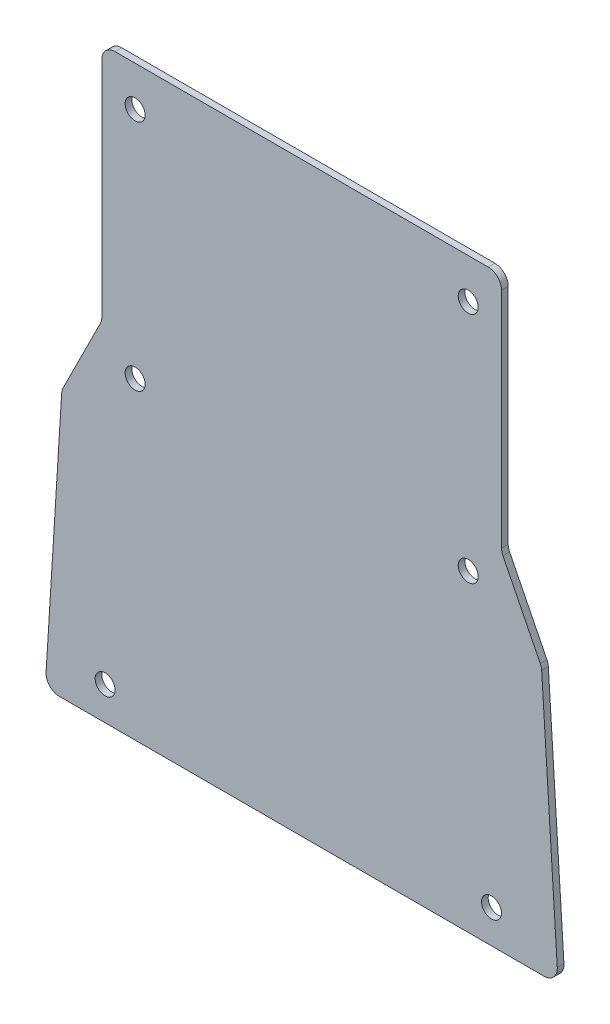
ISO-10303-21;
HEADER;
FILE_DESCRIPTION(('STEP AP214'),'2;1');
FILE_NAME('part.step','',(''),(''),'','','');
FILE_SCHEMA(('AUTOMOTIVE_DESIGN { 1 0 10303 214 1 1 1 1 }'));
ENDSEC;
DATA;
#1=APPLICATION_CONTEXT('core data for automotive mechanical design processes');
#2=APPLICATION_PROTOCOL_DEFINITION('international standard','automotive_design',2000,#1);
#3=PRODUCT_CONTEXT('',#1,'mechanical');
#4=PRODUCT('Part','Part','',(#3));
#5=PRODUCT_RELATED_PRODUCT_CATEGORY('part','',(#4));
#6=PRODUCT_DEFINITION_FORMATION('','',#4);
#7=PRODUCT_DEFINITION_CONTEXT('part definition',#1,'design');
#8=PRODUCT_DEFINITION('design','',#6,#7);
#9=PRODUCT_DEFINITION_SHAPE('','',#8);
#10=(LENGTH_UNIT() NAMED_UNIT(*) SI_UNIT(.MILLI.,.METRE.));
#11=(NAMED_UNIT(*) PLANE_ANGLE_UNIT() SI_UNIT($,.RADIAN.));
#12=(NAMED_UNIT(*) SI_UNIT($,.STERADIAN.) SOLID_ANGLE_UNIT());
#13=UNCERTAINTY_MEASURE_WITH_UNIT(LENGTH_MEASURE(1.E-05),#10,'distance_accuracy_value','');
#14=(GEOMETRIC_REPRESENTATION_CONTEXT(3) GLOBAL_UNCERTAINTY_ASSIGNED_CONTEXT((#13)) GLOBAL_UNIT_ASSIGNED_CONTEXT((#10,
#11,#12)) REPRESENTATION_CONTEXT('',''));
#15=CARTESIAN_POINT('',(0.,0.,0.));
#16=DIRECTION('',(0.,0.,1.));
#17=DIRECTION('',(1.,0.,0.));
#18=AXIS2_PLACEMENT_3D('',#15,#16,#17);
#19=CARTESIAN_POINT('',(38.5,0.,-1.));
#20=DIRECTION('',(0.998052578482888,0.0623782861551806,0.));
#21=DIRECTION('',(-0.0623782861551806,0.998052578482889,0.));
#22=AXIS2_PLACEMENT_3D('',#19,#20,#21);
#23=PLANE('',#22);
#24=DIRECTION('',(-0.0623782861551806,0.998052578482889,0.));
#25=VECTOR('',#24,1.);
#26=CARTESIAN_POINT('',(38.5,0.,-1.));
#27=LINE('',#26,#25);
#28=CARTESIAN_POINT('',(38.3672027142306,2.12475657231036,-1.));
#29=VERTEX_POINT('',#28);
#30=CARTESIAN_POINT('',(36.025369219197,39.5940924928484,-1.));
#31=VERTEX_POINT('',#30);
#32=EDGE_CURVE('E292',#29,#31,#27,.T.);
#33=ORIENTED_EDGE('',*,*,#32,.T.);
#34=DIRECTION('',(0.,0.,1.));
#35=VECTOR('',#34,1.);
#36=CARTESIAN_POINT('',(36.025369219197,39.5940924928484,-1.));
#37=LINE('',#36,#35);
#38=CARTESIAN_POINT('',(36.025369219197,39.5940924928484,0.));
#39=VERTEX_POINT('',#38);
#40=EDGE_CURVE('E167',#31,#39,#37,.T.);
#41=ORIENTED_EDGE('',*,*,#40,.T.);
#42=DIRECTION('',(-0.0623782861551806,0.998052578482889,0.));
#43=VECTOR('',#42,1.);
#44=CARTESIAN_POINT('',(38.5,0.,0.));
#45=LINE('',#44,#43);
#46=CARTESIAN_POINT('',(38.3672027142306,2.12475657231036,0.));
#47=VERTEX_POINT('',#46);
#48=EDGE_CURVE('E159',#47,#39,#45,.T.);
#49=ORIENTED_EDGE('',*,*,#48,.F.);
#50=DIRECTION('',(0.,0.,1.));
#51=VECTOR('',#50,1.);
#52=CARTESIAN_POINT('',(38.3672027142306,2.12475657231036,-1.));
#53=LINE('',#52,#51);
#54=EDGE_CURVE('E172',#47,#29,#53,.F.);
#55=ORIENTED_EDGE('',*,*,#54,.T.);
#56=EDGE_LOOP('',(#33,#41,#49,#55));
#57=FACE_BOUND('',#56,.T.);
#58=ADVANCED_FACE('F42',(#57),#23,.T.);
#59=CARTESIAN_POINT('',(-38.5,0.,-1.));
#60=DIRECTION('',(0.,-1.,0.));
#61=DIRECTION('',(0.,0.,-1.));
#62=AXIS2_PLACEMENT_3D('',#59,#60,#61);
#63=PLANE('',#62);
#64=DIRECTION('',(1.,0.,0.));
#65=VECTOR('',#64,1.);
#66=CARTESIAN_POINT('',(-38.5,0.,0.));
#67=LINE('',#66,#65);
#68=CARTESIAN_POINT('',(-36.3710975572648,0.,0.));
#69=VERTEX_POINT('',#68);
#70=CARTESIAN_POINT('',(36.3710975572648,0.,0.));
#71=VERTEX_POINT('',#70);
#72=EDGE_CURVE('E161',#69,#71,#67,.T.);
#73=ORIENTED_EDGE('',*,*,#72,.F.);
#74=DIRECTION('',(0.,0.,1.));
#75=VECTOR('',#74,1.);
#76=CARTESIAN_POINT('',(-36.3710975572648,0.,-1.));
#77=LINE('',#76,#75);
#78=CARTESIAN_POINT('',(-36.3710975572648,0.,-1.));
#79=VERTEX_POINT('',#78);
#80=EDGE_CURVE('E239',#69,#79,#77,.F.);
#81=ORIENTED_EDGE('',*,*,#80,.T.);
#82=DIRECTION('',(1.,0.,0.));
#83=VECTOR('',#82,1.);
#84=CARTESIAN_POINT('',(-38.5,0.,-1.));
#85=LINE('',#84,#83);
#86=CARTESIAN_POINT('',(36.3710975572648,0.,-1.));
#87=VERTEX_POINT('',#86);
#88=EDGE_CURVE('E180',#79,#87,#85,.T.);
#89=ORIENTED_EDGE('',*,*,#88,.T.);
#90=DIRECTION('',(0.,0.,1.));
#91=VECTOR('',#90,1.);
#92=CARTESIAN_POINT('',(36.3710975572648,0.,-1.));
#93=LINE('',#92,#91);
#94=EDGE_CURVE('E237',#87,#71,#93,.T.);
#95=ORIENTED_EDGE('',*,*,#94,.T.);
#96=EDGE_LOOP('',(#73,#81,#89,#95));
#97=FACE_BOUND('',#96,.T.);
#98=ADVANCED_FACE('F323',(#97),#63,.T.);
#99=CARTESIAN_POINT('',(-38.5,0.,-1.));
#100=DIRECTION('',(-0.998052578482888,0.0623782861551806,0.));
#101=DIRECTION('',(-0.0623782861551806,-0.998052578482889,0.));
#102=AXIS2_PLACEMENT_3D('',#99,#100,#101);
#103=PLANE('',#102);
#104=DIRECTION('',(-0.0623782861551806,-0.998052578482889,0.));
#105=VECTOR('',#104,1.);
#106=CARTESIAN_POINT('',(-38.5,0.,0.));
#107=LINE('',#106,#105);
#108=CARTESIAN_POINT('',(-36.025369219197,39.5940924928484,0.));
#109=VERTEX_POINT('',#108);
#110=CARTESIAN_POINT('',(-38.3672027142306,2.12475657231036,0.));
#111=VERTEX_POINT('',#110);
#112=EDGE_CURVE('E258',#109,#111,#107,.T.);
#113=ORIENTED_EDGE('',*,*,#112,.F.);
#114=DIRECTION('',(0.,0.,1.));
#115=VECTOR('',#114,1.);
#116=CARTESIAN_POINT('',(-36.025369219197,39.5940924928484,-1.));
#117=LINE('',#116,#115);
#118=CARTESIAN_POINT('',(-36.025369219197,39.5940924928484,-1.));
#119=VERTEX_POINT('',#118);
#120=EDGE_CURVE('E235',#109,#119,#117,.F.);
#121=ORIENTED_EDGE('',*,*,#120,.T.);
#122=DIRECTION('',(-0.0623782861551806,-0.998052578482889,0.));
#123=VECTOR('',#122,1.);
#124=CARTESIAN_POINT('',(-38.5,0.,-1.));
#125=LINE('',#124,#123);
#126=CARTESIAN_POINT('',(-38.3672027142306,2.12475657231036,-1.));
#127=VERTEX_POINT('',#126);
#128=EDGE_CURVE('E184',#119,#127,#125,.T.);
#129=ORIENTED_EDGE('',*,*,#128,.T.);
#130=DIRECTION('',(0.,0.,1.));
#131=VECTOR('',#130,1.);
#132=CARTESIAN_POINT('',(-38.3672027142306,2.12475657231036,-1.));
#133=LINE('',#132,#131);
#134=EDGE_CURVE('E232',#127,#111,#133,.T.);
#135=ORIENTED_EDGE('',*,*,#134,.T.);
#136=EDGE_LOOP('',(#113,#121,#129,#135));
#137=FACE_BOUND('',#136,.T.);
#138=ADVANCED_FACE('F328',(#137),#103,.T.);
#139=CARTESIAN_POINT('',(-36.,40.,-1.));
#140=DIRECTION('',(-0.894427190999916,0.447213595499958,0.));
#141=DIRECTION('',(-0.447213595499958,-0.894427190999916,0.));
#142=AXIS2_PLACEMENT_3D('',#139,#140,#141);
#143=PLANE('',#142);
#144=DIRECTION('',(-0.447213595499958,-0.894427190999916,0.));
#145=VECTOR('',#144,1.);
#146=CARTESIAN_POINT('',(-36.,40.,0.));
#147=LINE('',#146,#145);
#148=CARTESIAN_POINT('',(-30.2111456180002,51.5777087639997,0.));
#149=VERTEX_POINT('',#148);
#150=CARTESIAN_POINT('',(-35.818118444231,40.3637631115379,0.));
#151=VERTEX_POINT('',#150);
#152=EDGE_CURVE('E247',#149,#151,#147,.T.);
#153=ORIENTED_EDGE('',*,*,#152,.F.);
#154=DIRECTION('',(0.,0.,1.));
#155=VECTOR('',#154,1.);
#156=CARTESIAN_POINT('',(-30.2111456180002,51.5777087639997,-1.));
#157=LINE('',#156,#155);
#158=CARTESIAN_POINT('',(-30.2111456180002,51.5777087639997,-1.));
#159=VERTEX_POINT('',#158);
#160=EDGE_CURVE('E230',#149,#159,#157,.F.);
#161=ORIENTED_EDGE('',*,*,#160,.T.);
#162=DIRECTION('',(-0.447213595499958,-0.894427190999916,0.));
#163=VECTOR('',#162,1.);
#164=CARTESIAN_POINT('',(-36.,40.,-1.));
#165=LINE('',#164,#163);
#166=CARTESIAN_POINT('',(-35.818118444231,40.3637631115379,-1.));
#167=VERTEX_POINT('',#166);
#168=EDGE_CURVE('E268',#159,#167,#165,.T.);
#169=ORIENTED_EDGE('',*,*,#168,.T.);
#170=DIRECTION('',(0.,0.,1.));
#171=VECTOR('',#170,1.);
#172=CARTESIAN_POINT('',(-35.818118444231,40.3637631115379,-1.));
#173=LINE('',#172,#171);
#174=EDGE_CURVE('E227',#167,#151,#173,.T.);
#175=ORIENTED_EDGE('',*,*,#174,.T.);
#176=EDGE_LOOP('',(#153,#161,#169,#175));
#177=FACE_BOUND('',#176,.T.);
#178=ADVANCED_FACE('F254',(#177),#143,.T.);
#179=CARTESIAN_POINT('',(-30.,52.,-1.));
#180=DIRECTION('',(-1.,0.,0.));
#181=DIRECTION('',(0.,0.,1.));
#182=AXIS2_PLACEMENT_3D('',#179,#180,#181);
#183=PLANE('',#182);
#184=DIRECTION('',(0.,-1.,0.));
#185=VECTOR('',#184,1.);
#186=CARTESIAN_POINT('',(-30.,52.,0.));
#187=LINE('',#186,#185);
#188=CARTESIAN_POINT('',(-30.,86.,0.));
#189=VERTEX_POINT('',#188);
#190=CARTESIAN_POINT('',(-30.,52.4721359549996,0.));
#191=VERTEX_POINT('',#190);
#192=EDGE_CURVE('E249',#189,#191,#187,.T.);
#193=ORIENTED_EDGE('',*,*,#192,.F.);
#194=DIRECTION('',(0.,0.,1.));
#195=VECTOR('',#194,1.);
#196=CARTESIAN_POINT('',(-30.,86.,-1.));
#197=LINE('',#196,#195);
#198=CARTESIAN_POINT('',(-30.,86.,-1.));
#199=VERTEX_POINT('',#198);
#200=EDGE_CURVE('E225',#189,#199,#197,.F.);
#201=ORIENTED_EDGE('',*,*,#200,.T.);
#202=DIRECTION('',(0.,-1.,0.));
#203=VECTOR('',#202,1.);
#204=CARTESIAN_POINT('',(-30.,52.,-1.));
#205=LINE('',#204,#203);
#206=CARTESIAN_POINT('',(-30.,52.4721359549996,-1.));
#207=VERTEX_POINT('',#206);
#208=EDGE_CURVE('E266',#199,#207,#205,.T.);
#209=ORIENTED_EDGE('',*,*,#208,.T.);
#210=DIRECTION('',(0.,0.,1.));
#211=VECTOR('',#210,1.);
#212=CARTESIAN_POINT('',(-30.,52.4721359549996,0.));
#213=LINE('',#212,#211);
#214=EDGE_CURVE('E222',#207,#191,#213,.T.);
#215=ORIENTED_EDGE('',*,*,#214,.T.);
#216=EDGE_LOOP('',(#193,#201,#209,#215));
#217=FACE_BOUND('',#216,.T.);
#218=ADVANCED_FACE('F270',(#217),#183,.T.);
#219=CARTESIAN_POINT('',(30.,88.,-1.));
#220=DIRECTION('',(0.,1.,0.));
#221=DIRECTION('',(0.,0.,1.));
#222=AXIS2_PLACEMENT_3D('',#219,#220,#221);
#223=PLANE('',#222);
#224=DIRECTION('',(-1.,0.,0.));
#225=VECTOR('',#224,1.);
#226=CARTESIAN_POINT('',(30.,88.,0.));
#227=LINE('',#226,#225);
#228=CARTESIAN_POINT('',(28.,88.,0.));
#229=VERTEX_POINT('',#228);
#230=CARTESIAN_POINT('',(-28.,88.,0.));
#231=VERTEX_POINT('',#230);
#232=EDGE_CURVE('E287',#229,#231,#227,.T.);
#233=ORIENTED_EDGE('',*,*,#232,.F.);
#234=DIRECTION('',(0.,0.,1.));
#235=VECTOR('',#234,1.);
#236=CARTESIAN_POINT('',(28.,88.,-1.));
#237=LINE('',#236,#235);
#238=CARTESIAN_POINT('',(28.,88.,-1.));
#239=VERTEX_POINT('',#238);
#240=EDGE_CURVE('E220',#229,#239,#237,.F.);
#241=ORIENTED_EDGE('',*,*,#240,.T.);
#242=DIRECTION('',(-1.,0.,0.));
#243=VECTOR('',#242,1.);
#244=CARTESIAN_POINT('',(30.,88.,-1.));
#245=LINE('',#244,#243);
#246=CARTESIAN_POINT('',(-28.,88.,-1.));
#247=VERTEX_POINT('',#246);
#248=EDGE_CURVE('E272',#239,#247,#245,.T.);
#249=ORIENTED_EDGE('',*,*,#248,.T.);
#250=DIRECTION('',(0.,0.,1.));
#251=VECTOR('',#250,1.);
#252=CARTESIAN_POINT('',(-28.,88.,-1.));
#253=LINE('',#252,#251);
#254=EDGE_CURVE('E217',#247,#231,#253,.T.);
#255=ORIENTED_EDGE('',*,*,#254,.T.);
#256=EDGE_LOOP('',(#233,#241,#249,#255));
#257=FACE_BOUND('',#256,.T.);
#258=ADVANCED_FACE('F308',(#257),#223,.T.);
#259=CARTESIAN_POINT('',(30.,52.,-1.));
#260=DIRECTION('',(1.,0.,0.));
#261=DIRECTION('',(0.,0.,-1.));
#262=AXIS2_PLACEMENT_3D('',#259,#260,#261);
#263=PLANE('',#262);
#264=DIRECTION('',(0.,1.,0.));
#265=VECTOR('',#264,1.);
#266=CARTESIAN_POINT('',(30.,52.,0.));
#267=LINE('',#266,#265);
#268=CARTESIAN_POINT('',(30.,52.4721359549996,0.));
#269=VERTEX_POINT('',#268);
#270=CARTESIAN_POINT('',(30.,86.,0.));
#271=VERTEX_POINT('',#270);
#272=EDGE_CURVE('E284',#269,#271,#267,.T.);
#273=ORIENTED_EDGE('',*,*,#272,.F.);
#274=DIRECTION('',(0.,0.,1.));
#275=VECTOR('',#274,1.);
#276=CARTESIAN_POINT('',(30.,52.4721359549996,-1.));
#277=LINE('',#276,#275);
#278=CARTESIAN_POINT('',(30.,52.4721359549996,-1.));
#279=VERTEX_POINT('',#278);
#280=EDGE_CURVE('E64',#269,#279,#277,.F.);
#281=ORIENTED_EDGE('',*,*,#280,.T.);
#282=DIRECTION('',(0.,1.,0.));
#283=VECTOR('',#282,1.);
#284=CARTESIAN_POINT('',(30.,52.,-1.));
#285=LINE('',#284,#283);
#286=CARTESIAN_POINT('',(30.,86.,-1.));
#287=VERTEX_POINT('',#286);
#288=EDGE_CURVE('E276',#279,#287,#285,.T.);
#289=ORIENTED_EDGE('',*,*,#288,.T.);
#290=DIRECTION('',(0.,0.,1.));
#291=VECTOR('',#290,1.);
#292=CARTESIAN_POINT('',(30.,86.,-1.));
#293=LINE('',#292,#291);
#294=EDGE_CURVE('E213',#287,#271,#293,.T.);
#295=ORIENTED_EDGE('',*,*,#294,.T.);
#296=EDGE_LOOP('',(#273,#281,#289,#295));
#297=FACE_BOUND('',#296,.T.);
#298=ADVANCED_FACE('F301',(#297),#263,.T.);
#299=CARTESIAN_POINT('',(36.,40.,-1.));
#300=DIRECTION('',(0.894427190999916,0.447213595499958,0.));
#301=DIRECTION('',(-0.447213595499958,0.894427190999916,0.));
#302=AXIS2_PLACEMENT_3D('',#299,#300,#301);
#303=PLANE('',#302);
#304=DIRECTION('',(-0.447213595499958,0.894427190999916,0.));
#305=VECTOR('',#304,1.);
#306=CARTESIAN_POINT('',(36.,40.,0.));
#307=LINE('',#306,#305);
#308=CARTESIAN_POINT('',(35.818118444231,40.3637631115379,0.));
#309=VERTEX_POINT('',#308);
#310=CARTESIAN_POINT('',(30.2111456180002,51.5777087639997,0.));
#311=VERTEX_POINT('',#310);
#312=EDGE_CURVE('E175',#309,#311,#307,.T.);
#313=ORIENTED_EDGE('',*,*,#312,.F.);
#314=DIRECTION('',(0.,0.,1.));
#315=VECTOR('',#314,1.);
#316=CARTESIAN_POINT('',(35.818118444231,40.3637631115379,-1.));
#317=LINE('',#316,#315);
#318=CARTESIAN_POINT('',(35.818118444231,40.3637631115379,-1.));
#319=VERTEX_POINT('',#318);
#320=EDGE_CURVE('E201',#309,#319,#317,.F.);
#321=ORIENTED_EDGE('',*,*,#320,.T.);
#322=DIRECTION('',(-0.447213595499958,0.894427190999916,0.));
#323=VECTOR('',#322,1.);
#324=CARTESIAN_POINT('',(36.,40.,-1.));
#325=LINE('',#324,#323);
#326=CARTESIAN_POINT('',(30.2111456180002,51.5777087639997,-1.));
#327=VERTEX_POINT('',#326);
#328=EDGE_CURVE('E293',#319,#327,#325,.T.);
#329=ORIENTED_EDGE('',*,*,#328,.T.);
#330=DIRECTION('',(0.,0.,1.));
#331=VECTOR('',#330,1.);
#332=CARTESIAN_POINT('',(30.2111456180002,51.5777087639997,0.));
#333=LINE('',#332,#331);
#334=EDGE_CURVE('E198',#327,#311,#333,.T.);
#335=ORIENTED_EDGE('',*,*,#334,.T.);
#336=EDGE_LOOP('',(#313,#321,#329,#335));
#337=FACE_BOUND('',#336,.T.);
#338=ADVANCED_FACE('F333',(#337),#303,.T.);
#339=CARTESIAN_POINT('',(0.,0.,-1.));
#340=DIRECTION('',(0.,0.,1.));
#341=DIRECTION('',(1.,0.,0.));
#342=AXIS2_PLACEMENT_3D('',#339,#340,#341);
#343=PLANE('',#342);
#344=CARTESIAN_POINT('',(28.5,5.,-1.));
#345=DIRECTION('',(0.,0.,1.));
#346=DIRECTION('',(1.,0.,0.));
#347=AXIS2_PLACEMENT_3D('',#344,#345,#346);
#348=CIRCLE('',#347,1.5);
#349=CARTESIAN_POINT('',(30.,5.,-1.));
#350=VERTEX_POINT('',#349);
#351=EDGE_CURVE('E626',#350,#350,#348,.T.);
#352=ORIENTED_EDGE('',*,*,#351,.T.);
#353=EDGE_LOOP('',(#352));
#354=FACE_BOUND('',#353,.T.);
#355=CARTESIAN_POINT('',(25.,82.,-1.));
#356=DIRECTION('',(0.,0.,1.));
#357=DIRECTION('',(1.,0.,0.));
#358=AXIS2_PLACEMENT_3D('',#355,#356,#357);
#359=CIRCLE('',#358,1.5);
#360=CARTESIAN_POINT('',(26.5,82.,-1.));
#361=VERTEX_POINT('',#360);
#362=EDGE_CURVE('E645',#361,#361,#359,.T.);
#363=ORIENTED_EDGE('',*,*,#362,.T.);
#364=EDGE_LOOP('',(#363));
#365=FACE_BOUND('',#364,.T.);
#366=CARTESIAN_POINT('',(-25.,47.,-1.));
#367=DIRECTION('',(0.,0.,1.));
#368=DIRECTION('',(1.,0.,0.));
#369=AXIS2_PLACEMENT_3D('',#366,#367,#368);
#370=CIRCLE('',#369,1.5);
#371=CARTESIAN_POINT('',(-23.5,47.,-1.));
#372=VERTEX_POINT('',#371);
#373=EDGE_CURVE('E637',#372,#372,#370,.T.);
#374=ORIENTED_EDGE('',*,*,#373,.T.);
#375=EDGE_LOOP('',(#374));
#376=FACE_BOUND('',#375,.T.);
#377=CARTESIAN_POINT('',(25.,47.,-1.));
#378=DIRECTION('',(0.,0.,1.));
#379=DIRECTION('',(1.,0.,0.));
#380=AXIS2_PLACEMENT_3D('',#377,#378,#379);
#381=CIRCLE('',#380,1.5);
#382=CARTESIAN_POINT('',(26.5,47.,-1.));
#383=VERTEX_POINT('',#382);
#384=EDGE_CURVE('E661',#383,#383,#381,.T.);
#385=ORIENTED_EDGE('',*,*,#384,.T.);
#386=EDGE_LOOP('',(#385));
#387=FACE_BOUND('',#386,.T.);
#388=CARTESIAN_POINT('',(-29.5,5.,-1.));
#389=DIRECTION('',(0.,0.,1.));
#390=DIRECTION('',(1.,0.,0.));
#391=AXIS2_PLACEMENT_3D('',#388,#389,#390);
#392=CIRCLE('',#391,1.5);
#393=CARTESIAN_POINT('',(-28.,5.,-1.));
#394=VERTEX_POINT('',#393);
#395=EDGE_CURVE('E630',#394,#394,#392,.T.);
#396=ORIENTED_EDGE('',*,*,#395,.T.);
#397=EDGE_LOOP('',(#396));
#398=FACE_BOUND('',#397,.T.);
#399=CARTESIAN_POINT('',(-25.,82.,-1.));
#400=DIRECTION('',(0.,0.,1.));
#401=DIRECTION('',(1.,0.,0.));
#402=AXIS2_PLACEMENT_3D('',#399,#400,#401);
#403=CIRCLE('',#402,1.5);
#404=CARTESIAN_POINT('',(-23.5,82.,-1.));
#405=VERTEX_POINT('',#404);
#406=EDGE_CURVE('E176',#405,#405,#403,.T.);
#407=ORIENTED_EDGE('',*,*,#406,.T.);
#408=EDGE_LOOP('',(#407));
#409=FACE_BOUND('',#408,.T.);
#410=ORIENTED_EDGE('',*,*,#328,.F.);
#411=CARTESIAN_POINT('',(34.0292640622312,39.469335920538,-1.));
#412=DIRECTION('',(0.,0.,1.));
#413=DIRECTION('',(1.,0.,0.));
#414=AXIS2_PLACEMENT_3D('',#411,#412,#413);
#415=CIRCLE('',#414,2.);
#416=EDGE_CURVE('E211',#319,#31,#415,.F.);
#417=ORIENTED_EDGE('',*,*,#416,.T.);
#418=ORIENTED_EDGE('',*,*,#32,.F.);
#419=CARTESIAN_POINT('',(36.3710975572648,2.,-1.));
#420=DIRECTION('',(0.,0.,1.));
#421=DIRECTION('',(1.,0.,0.));
#422=AXIS2_PLACEMENT_3D('',#419,#420,#421);
#423=CIRCLE('',#422,2.);
#424=EDGE_CURVE('E179',#29,#87,#423,.F.);
#425=ORIENTED_EDGE('',*,*,#424,.T.);
#426=ORIENTED_EDGE('',*,*,#88,.F.);
#427=CARTESIAN_POINT('',(-36.3710975572648,2.,-1.));
#428=DIRECTION('',(0.,0.,1.));
#429=DIRECTION('',(1.,0.,0.));
#430=AXIS2_PLACEMENT_3D('',#427,#428,#429);
#431=CIRCLE('',#430,2.);
#432=EDGE_CURVE('E204',#79,#127,#431,.F.);
#433=ORIENTED_EDGE('',*,*,#432,.T.);
#434=ORIENTED_EDGE('',*,*,#128,.F.);
#435=CARTESIAN_POINT('',(-34.0292640622312,39.469335920538,-1.));
#436=DIRECTION('',(0.,0.,1.));
#437=DIRECTION('',(1.,0.,0.));
#438=AXIS2_PLACEMENT_3D('',#435,#436,#437);
#439=CIRCLE('',#438,2.);
#440=EDGE_CURVE('E206',#119,#167,#439,.F.);
#441=ORIENTED_EDGE('',*,*,#440,.T.);
#442=ORIENTED_EDGE('',*,*,#168,.F.);
#443=CARTESIAN_POINT('',(-32.,52.4721359549996,-1.));
#444=DIRECTION('',(0.,0.,1.));
#445=DIRECTION('',(1.,0.,0.));
#446=AXIS2_PLACEMENT_3D('',#443,#444,#445);
#447=CIRCLE('',#446,2.);
#448=EDGE_CURVE('E11',#159,#207,#447,.T.);
#449=ORIENTED_EDGE('',*,*,#448,.T.);
#450=ORIENTED_EDGE('',*,*,#208,.F.);
#451=CARTESIAN_POINT('',(-28.,86.,-1.));
#452=DIRECTION('',(0.,0.,1.));
#453=DIRECTION('',(1.,0.,0.));
#454=AXIS2_PLACEMENT_3D('',#451,#452,#453);
#455=CIRCLE('',#454,2.);
#456=EDGE_CURVE('E208',#199,#247,#455,.F.);
#457=ORIENTED_EDGE('',*,*,#456,.T.);
#458=ORIENTED_EDGE('',*,*,#248,.F.);
#459=CARTESIAN_POINT('',(28.,86.,-1.));
#460=DIRECTION('',(0.,0.,1.));
#461=DIRECTION('',(1.,0.,0.));
#462=AXIS2_PLACEMENT_3D('',#459,#460,#461);
#463=CIRCLE('',#462,2.);
#464=EDGE_CURVE('E57',#239,#287,#463,.F.);
#465=ORIENTED_EDGE('',*,*,#464,.T.);
#466=ORIENTED_EDGE('',*,*,#288,.F.);
#467=CARTESIAN_POINT('',(32.,52.4721359549996,-1.));
#468=DIRECTION('',(0.,0.,1.));
#469=DIRECTION('',(1.,0.,0.));
#470=AXIS2_PLACEMENT_3D('',#467,#468,#469);
#471=CIRCLE('',#470,2.);
#472=EDGE_CURVE('E243',#279,#327,#471,.T.);
#473=ORIENTED_EDGE('',*,*,#472,.T.);
#474=EDGE_LOOP('',(#410,#417,#418,#425,#426,#433,#434,#441,#442,#449,#450,#457,#458,#465,#466,#473));
#475=FACE_BOUND('',#474,.T.);
#476=ADVANCED_FACE('F265',(#354,#365,#376,#387,#398,#409,#475),#343,.F.);
#477=CARTESIAN_POINT('',(0.,0.,0.));
#478=DIRECTION('',(0.,0.,1.));
#479=DIRECTION('',(1.,0.,0.));
#480=AXIS2_PLACEMENT_3D('',#477,#478,#479);
#481=PLANE('',#480);
#482=CARTESIAN_POINT('',(28.5,5.,0.));
#483=DIRECTION('',(0.,0.,1.));
#484=DIRECTION('',(1.,0.,0.));
#485=AXIS2_PLACEMENT_3D('',#482,#483,#484);
#486=CIRCLE('',#485,1.5);
#487=CARTESIAN_POINT('',(30.,5.,0.));
#488=VERTEX_POINT('',#487);
#489=EDGE_CURVE('E629',#488,#488,#486,.T.);
#490=ORIENTED_EDGE('',*,*,#489,.F.);
#491=EDGE_LOOP('',(#490));
#492=FACE_BOUND('',#491,.T.);
#493=CARTESIAN_POINT('',(25.,82.,0.));
#494=DIRECTION('',(0.,0.,1.));
#495=DIRECTION('',(1.,0.,0.));
#496=AXIS2_PLACEMENT_3D('',#493,#494,#495);
#497=CIRCLE('',#496,1.5);
#498=CARTESIAN_POINT('',(26.5,82.,0.));
#499=VERTEX_POINT('',#498);
#500=EDGE_CURVE('E642',#499,#499,#497,.T.);
#501=ORIENTED_EDGE('',*,*,#500,.F.);
#502=EDGE_LOOP('',(#501));
#503=FACE_BOUND('',#502,.T.);
#504=CARTESIAN_POINT('',(-25.,47.,0.));
#505=DIRECTION('',(0.,0.,1.));
#506=DIRECTION('',(1.,0.,0.));
#507=AXIS2_PLACEMENT_3D('',#504,#505,#506);
#508=CIRCLE('',#507,1.5);
#509=CARTESIAN_POINT('',(-23.5,47.,0.));
#510=VERTEX_POINT('',#509);
#511=EDGE_CURVE('E650',#510,#510,#508,.T.);
#512=ORIENTED_EDGE('',*,*,#511,.F.);
#513=EDGE_LOOP('',(#512));
#514=FACE_BOUND('',#513,.T.);
#515=CARTESIAN_POINT('',(25.,47.,0.));
#516=DIRECTION('',(0.,0.,1.));
#517=DIRECTION('',(1.,0.,0.));
#518=AXIS2_PLACEMENT_3D('',#515,#516,#517);
#519=CIRCLE('',#518,1.5);
#520=CARTESIAN_POINT('',(26.5,47.,0.));
#521=VERTEX_POINT('',#520);
#522=EDGE_CURVE('E657',#521,#521,#519,.T.);
#523=ORIENTED_EDGE('',*,*,#522,.F.);
#524=EDGE_LOOP('',(#523));
#525=FACE_BOUND('',#524,.T.);
#526=CARTESIAN_POINT('',(-29.5,5.,0.));
#527=DIRECTION('',(0.,0.,1.));
#528=DIRECTION('',(1.,0.,0.));
#529=AXIS2_PLACEMENT_3D('',#526,#527,#528);
#530=CIRCLE('',#529,1.5);
#531=CARTESIAN_POINT('',(-28.,5.,0.));
#532=VERTEX_POINT('',#531);
#533=EDGE_CURVE('E633',#532,#532,#530,.T.);
#534=ORIENTED_EDGE('',*,*,#533,.F.);
#535=EDGE_LOOP('',(#534));
#536=FACE_BOUND('',#535,.T.);
#537=CARTESIAN_POINT('',(-25.,82.,0.));
#538=DIRECTION('',(0.,0.,1.));
#539=DIRECTION('',(1.,0.,0.));
#540=AXIS2_PLACEMENT_3D('',#537,#538,#539);
#541=CIRCLE('',#540,1.5);
#542=CARTESIAN_POINT('',(-23.5,82.,0.));
#543=VERTEX_POINT('',#542);
#544=EDGE_CURVE('E298',#543,#543,#541,.T.);
#545=ORIENTED_EDGE('',*,*,#544,.F.);
#546=EDGE_LOOP('',(#545));
#547=FACE_BOUND('',#546,.T.);
#548=ORIENTED_EDGE('',*,*,#48,.T.);
#549=CARTESIAN_POINT('',(34.0292640622312,39.469335920538,0.));
#550=DIRECTION('',(0.,0.,1.));
#551=DIRECTION('',(1.,0.,0.));
#552=AXIS2_PLACEMENT_3D('',#549,#550,#551);
#553=CIRCLE('',#552,2.);
#554=EDGE_CURVE('E196',#39,#309,#553,.T.);
#555=ORIENTED_EDGE('',*,*,#554,.T.);
#556=ORIENTED_EDGE('',*,*,#312,.T.);
#557=CARTESIAN_POINT('',(32.,52.4721359549996,0.));
#558=DIRECTION('',(0.,0.,1.));
#559=DIRECTION('',(1.,0.,0.));
#560=AXIS2_PLACEMENT_3D('',#557,#558,#559);
#561=CIRCLE('',#560,2.);
#562=EDGE_CURVE('E241',#311,#269,#561,.F.);
#563=ORIENTED_EDGE('',*,*,#562,.T.);
#564=ORIENTED_EDGE('',*,*,#272,.T.);
#565=CARTESIAN_POINT('',(28.,86.,0.));
#566=DIRECTION('',(0.,0.,1.));
#567=DIRECTION('',(1.,0.,0.));
#568=AXIS2_PLACEMENT_3D('',#565,#566,#567);
#569=CIRCLE('',#568,2.);
#570=EDGE_CURVE('E194',#271,#229,#569,.T.);
#571=ORIENTED_EDGE('',*,*,#570,.T.);
#572=ORIENTED_EDGE('',*,*,#232,.T.);
#573=CARTESIAN_POINT('',(-28.,86.,0.));
#574=DIRECTION('',(0.,0.,1.));
#575=DIRECTION('',(1.,0.,0.));
#576=AXIS2_PLACEMENT_3D('',#573,#574,#575);
#577=CIRCLE('',#576,2.);
#578=EDGE_CURVE('E192',#231,#189,#577,.T.);
#579=ORIENTED_EDGE('',*,*,#578,.T.);
#580=ORIENTED_EDGE('',*,*,#192,.T.);
#581=CARTESIAN_POINT('',(-32.,52.4721359549996,0.));
#582=DIRECTION('',(0.,0.,1.));
#583=DIRECTION('',(1.,0.,0.));
#584=AXIS2_PLACEMENT_3D('',#581,#582,#583);
#585=CIRCLE('',#584,2.);
#586=EDGE_CURVE('E50',#191,#149,#585,.F.);
#587=ORIENTED_EDGE('',*,*,#586,.T.);
#588=ORIENTED_EDGE('',*,*,#152,.T.);
#589=CARTESIAN_POINT('',(-34.0292640622312,39.469335920538,0.));
#590=DIRECTION('',(0.,0.,1.));
#591=DIRECTION('',(1.,0.,0.));
#592=AXIS2_PLACEMENT_3D('',#589,#590,#591);
#593=CIRCLE('',#592,2.);
#594=EDGE_CURVE('E190',#151,#109,#593,.T.);
#595=ORIENTED_EDGE('',*,*,#594,.T.);
#596=ORIENTED_EDGE('',*,*,#112,.T.);
#597=CARTESIAN_POINT('',(-36.3710975572648,2.,0.));
#598=DIRECTION('',(0.,0.,1.));
#599=DIRECTION('',(1.,0.,0.));
#600=AXIS2_PLACEMENT_3D('',#597,#598,#599);
#601=CIRCLE('',#600,2.);
#602=EDGE_CURVE('E166',#111,#69,#601,.T.);
#603=ORIENTED_EDGE('',*,*,#602,.T.);
#604=ORIENTED_EDGE('',*,*,#72,.T.);
#605=CARTESIAN_POINT('',(36.3710975572648,2.,0.));
#606=DIRECTION('',(0.,0.,1.));
#607=DIRECTION('',(1.,0.,0.));
#608=AXIS2_PLACEMENT_3D('',#605,#606,#607);
#609=CIRCLE('',#608,2.);
#610=EDGE_CURVE('E156',#71,#47,#609,.T.);
#611=ORIENTED_EDGE('',*,*,#610,.T.);
#612=EDGE_LOOP('',(#548,#555,#556,#563,#564,#571,#572,#579,#580,#587,#588,#595,#596,#603,#604,#611));
#613=FACE_BOUND('',#612,.T.);
#614=ADVANCED_FACE('F158',(#492,#503,#514,#525,#536,#547,#613),#481,.T.);
#615=CARTESIAN_POINT('',(34.0292640622312,39.469335920538,-1.));
#616=DIRECTION('',(0.,0.,1.));
#617=DIRECTION('',(1.,0.,0.));
#618=AXIS2_PLACEMENT_3D('',#615,#616,#617);
#619=CYLINDRICAL_SURFACE('',#618,2.);
#620=ORIENTED_EDGE('',*,*,#416,.F.);
#621=ORIENTED_EDGE('',*,*,#320,.F.);
#622=ORIENTED_EDGE('',*,*,#554,.F.);
#623=ORIENTED_EDGE('',*,*,#40,.F.);
#624=EDGE_LOOP('',(#620,#621,#622,#623));
#625=FACE_BOUND('',#624,.T.);
#626=ADVANCED_FACE('F335',(#625),#619,.T.);
#627=CARTESIAN_POINT('',(32.,52.4721359549996,-1.));
#628=DIRECTION('',(0.,0.,-1.));
#629=DIRECTION('',(-1.,0.,0.));
#630=AXIS2_PLACEMENT_3D('',#627,#628,#629);
#631=CYLINDRICAL_SURFACE('',#630,2.);
#632=ORIENTED_EDGE('',*,*,#472,.F.);
#633=ORIENTED_EDGE('',*,*,#280,.F.);
#634=ORIENTED_EDGE('',*,*,#562,.F.);
#635=ORIENTED_EDGE('',*,*,#334,.F.);
#636=EDGE_LOOP('',(#632,#633,#634,#635));
#637=FACE_BOUND('',#636,.T.);
#638=ADVANCED_FACE('F320',(#637),#631,.F.);
#639=CARTESIAN_POINT('',(28.,86.,-1.));
#640=DIRECTION('',(0.,0.,1.));
#641=DIRECTION('',(1.,0.,0.));
#642=AXIS2_PLACEMENT_3D('',#639,#640,#641);
#643=CYLINDRICAL_SURFACE('',#642,2.);
#644=ORIENTED_EDGE('',*,*,#464,.F.);
#645=ORIENTED_EDGE('',*,*,#240,.F.);
#646=ORIENTED_EDGE('',*,*,#570,.F.);
#647=ORIENTED_EDGE('',*,*,#294,.F.);
#648=EDGE_LOOP('',(#644,#645,#646,#647));
#649=FACE_BOUND('',#648,.T.);
#650=ADVANCED_FACE('F304',(#649),#643,.T.);
#651=CARTESIAN_POINT('',(-28.,86.,-1.));
#652=DIRECTION('',(0.,0.,1.));
#653=DIRECTION('',(1.,0.,0.));
#654=AXIS2_PLACEMENT_3D('',#651,#652,#653);
#655=CYLINDRICAL_SURFACE('',#654,2.);
#656=ORIENTED_EDGE('',*,*,#456,.F.);
#657=ORIENTED_EDGE('',*,*,#200,.F.);
#658=ORIENTED_EDGE('',*,*,#578,.F.);
#659=ORIENTED_EDGE('',*,*,#254,.F.);
#660=EDGE_LOOP('',(#656,#657,#658,#659));
#661=FACE_BOUND('',#660,.T.);
#662=ADVANCED_FACE('F311',(#661),#655,.T.);
#663=CARTESIAN_POINT('',(-32.,52.4721359549996,-1.));
#664=DIRECTION('',(0.,0.,-1.));
#665=DIRECTION('',(-1.,0.,0.));
#666=AXIS2_PLACEMENT_3D('',#663,#664,#665);
#667=CYLINDRICAL_SURFACE('',#666,2.);
#668=ORIENTED_EDGE('',*,*,#448,.F.);
#669=ORIENTED_EDGE('',*,*,#160,.F.);
#670=ORIENTED_EDGE('',*,*,#586,.F.);
#671=ORIENTED_EDGE('',*,*,#214,.F.);
#672=EDGE_LOOP('',(#668,#669,#670,#671));
#673=FACE_BOUND('',#672,.T.);
#674=ADVANCED_FACE('F261',(#673),#667,.F.);
#675=CARTESIAN_POINT('',(-34.0292640622312,39.469335920538,-1.));
#676=DIRECTION('',(0.,0.,1.));
#677=DIRECTION('',(1.,0.,0.));
#678=AXIS2_PLACEMENT_3D('',#675,#676,#677);
#679=CYLINDRICAL_SURFACE('',#678,2.);
#680=ORIENTED_EDGE('',*,*,#440,.F.);
#681=ORIENTED_EDGE('',*,*,#120,.F.);
#682=ORIENTED_EDGE('',*,*,#594,.F.);
#683=ORIENTED_EDGE('',*,*,#174,.F.);
#684=EDGE_LOOP('',(#680,#681,#682,#683));
#685=FACE_BOUND('',#684,.T.);
#686=ADVANCED_FACE('F318',(#685),#679,.T.);
#687=CARTESIAN_POINT('',(-36.3710975572648,2.,-1.));
#688=DIRECTION('',(0.,0.,1.));
#689=DIRECTION('',(1.,0.,0.));
#690=AXIS2_PLACEMENT_3D('',#687,#688,#689);
#691=CYLINDRICAL_SURFACE('',#690,2.);
#692=ORIENTED_EDGE('',*,*,#432,.F.);
#693=ORIENTED_EDGE('',*,*,#80,.F.);
#694=ORIENTED_EDGE('',*,*,#602,.F.);
#695=ORIENTED_EDGE('',*,*,#134,.F.);
#696=EDGE_LOOP('',(#692,#693,#694,#695));
#697=FACE_BOUND('',#696,.T.);
#698=ADVANCED_FACE('F352',(#697),#691,.T.);
#699=CARTESIAN_POINT('',(36.3710975572648,2.,-1.));
#700=DIRECTION('',(0.,0.,1.));
#701=DIRECTION('',(1.,0.,0.));
#702=AXIS2_PLACEMENT_3D('',#699,#700,#701);
#703=CYLINDRICAL_SURFACE('',#702,2.);
#704=ORIENTED_EDGE('',*,*,#424,.F.);
#705=ORIENTED_EDGE('',*,*,#54,.F.);
#706=ORIENTED_EDGE('',*,*,#610,.F.);
#707=ORIENTED_EDGE('',*,*,#94,.F.);
#708=EDGE_LOOP('',(#704,#705,#706,#707));
#709=FACE_BOUND('',#708,.T.);
#710=ADVANCED_FACE('F44',(#709),#703,.T.);
#711=CARTESIAN_POINT('',(-25.,82.,-1.));
#712=DIRECTION('',(0.,0.,1.));
#713=DIRECTION('',(1.,0.,0.));
#714=AXIS2_PLACEMENT_3D('',#711,#712,#713);
#715=CYLINDRICAL_SURFACE('',#714,1.5);
#716=ORIENTED_EDGE('',*,*,#406,.F.);
#717=EDGE_LOOP('',(#716));
#718=FACE_BOUND('',#717,.T.);
#719=ORIENTED_EDGE('',*,*,#544,.T.);
#720=EDGE_LOOP('',(#719));
#721=FACE_BOUND('',#720,.T.);
#722=ADVANCED_FACE('F367',(#718,#721),#715,.F.);
#723=CARTESIAN_POINT('',(-29.5,5.,-1.));
#724=DIRECTION('',(0.,0.,1.));
#725=DIRECTION('',(1.,0.,0.));
#726=AXIS2_PLACEMENT_3D('',#723,#724,#725);
#727=CYLINDRICAL_SURFACE('',#726,1.5);
#728=ORIENTED_EDGE('',*,*,#395,.F.);
#729=EDGE_LOOP('',(#728));
#730=FACE_BOUND('',#729,.T.);
#731=ORIENTED_EDGE('',*,*,#533,.T.);
#732=EDGE_LOOP('',(#731));
#733=FACE_BOUND('',#732,.T.);
#734=ADVANCED_FACE('F371',(#730,#733),#727,.F.);
#735=CARTESIAN_POINT('',(25.,47.,-1.));
#736=DIRECTION('',(0.,0.,1.));
#737=DIRECTION('',(1.,0.,0.));
#738=AXIS2_PLACEMENT_3D('',#735,#736,#737);
#739=CYLINDRICAL_SURFACE('',#738,1.5);
#740=ORIENTED_EDGE('',*,*,#384,.F.);
#741=EDGE_LOOP('',(#740));
#742=FACE_BOUND('',#741,.T.);
#743=ORIENTED_EDGE('',*,*,#522,.T.);
#744=EDGE_LOOP('',(#743));
#745=FACE_BOUND('',#744,.T.);
#746=ADVANCED_FACE('F377',(#742,#745),#739,.F.);
#747=CARTESIAN_POINT('',(-25.,47.,-1.));
#748=DIRECTION('',(0.,0.,1.));
#749=DIRECTION('',(1.,0.,0.));
#750=AXIS2_PLACEMENT_3D('',#747,#748,#749);
#751=CYLINDRICAL_SURFACE('',#750,1.5);
#752=ORIENTED_EDGE('',*,*,#373,.F.);
#753=EDGE_LOOP('',(#752));
#754=FACE_BOUND('',#753,.T.);
#755=ORIENTED_EDGE('',*,*,#511,.T.);
#756=EDGE_LOOP('',(#755));
#757=FACE_BOUND('',#756,.T.);
#758=ADVANCED_FACE('F490',(#754,#757),#751,.F.);
#759=CARTESIAN_POINT('',(25.,82.,-1.));
#760=DIRECTION('',(0.,0.,1.));
#761=DIRECTION('',(1.,0.,0.));
#762=AXIS2_PLACEMENT_3D('',#759,#760,#761);
#763=CYLINDRICAL_SURFACE('',#762,1.5);
#764=ORIENTED_EDGE('',*,*,#362,.F.);
#765=EDGE_LOOP('',(#764));
#766=FACE_BOUND('',#765,.T.);
#767=ORIENTED_EDGE('',*,*,#500,.T.);
#768=EDGE_LOOP('',(#767));
#769=FACE_BOUND('',#768,.T.);
#770=ADVANCED_FACE('F502',(#766,#769),#763,.F.);
#771=CARTESIAN_POINT('',(28.5,5.,-1.));
#772=DIRECTION('',(0.,0.,1.));
#773=DIRECTION('',(1.,0.,0.));
#774=AXIS2_PLACEMENT_3D('',#771,#772,#773);
#775=CYLINDRICAL_SURFACE('',#774,1.5);
#776=ORIENTED_EDGE('',*,*,#351,.F.);
#777=EDGE_LOOP('',(#776));
#778=FACE_BOUND('',#777,.T.);
#779=ORIENTED_EDGE('',*,*,#489,.T.);
#780=EDGE_LOOP('',(#779));
#781=FACE_BOUND('',#780,.T.);
#782=ADVANCED_FACE('F384',(#778,#781),#775,.F.);
#783=CLOSED_SHELL('',(#58,#98,#138,#178,#218,#258,#298,#338,#476,#614,#626,#638,#650,#662,#674,
#686,#698,#710,#722,#734,#746,#758,#770,#782));
#784=MANIFOLD_SOLID_BREP('B2',#783);
#785=ADVANCED_BREP_SHAPE_REPRESENTATION('',(#18,#784),#14);
#786=SHAPE_DEFINITION_REPRESENTATION(#9,#785);
ENDSEC;
END-ISO-10303-21;
